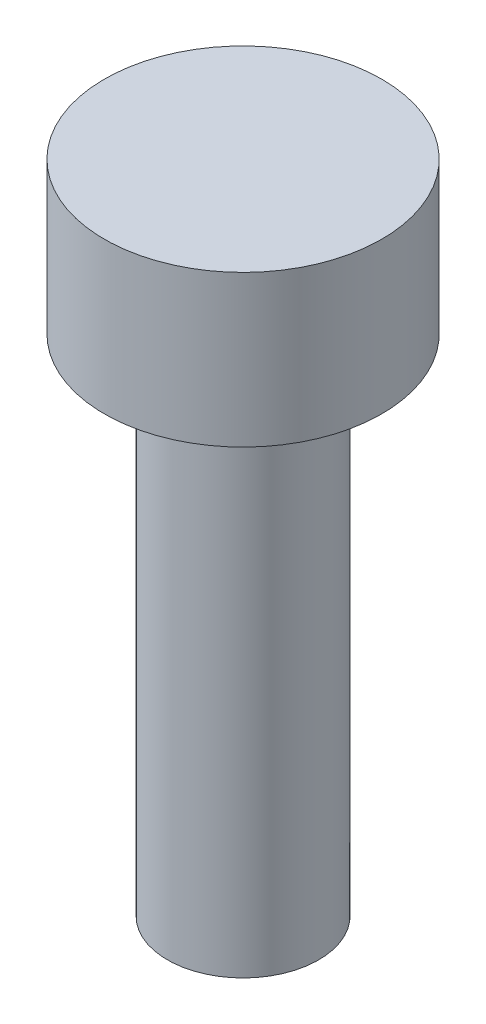
ISO-10303-21;
HEADER;
FILE_DESCRIPTION(('STEP AP214'),'2;1');
FILE_NAME('part.step','',(''),(''),'','','');
FILE_SCHEMA(('AUTOMOTIVE_DESIGN { 1 0 10303 214 1 1 1 1 }'));
ENDSEC;
DATA;
#1=APPLICATION_CONTEXT('core data for automotive mechanical design processes');
#2=APPLICATION_PROTOCOL_DEFINITION('international standard','automotive_design',2000,#1);
#3=PRODUCT_CONTEXT('',#1,'mechanical');
#4=PRODUCT('Part','Part','',(#3));
#5=PRODUCT_RELATED_PRODUCT_CATEGORY('part','',(#4));
#6=PRODUCT_DEFINITION_FORMATION('','',#4);
#7=PRODUCT_DEFINITION_CONTEXT('part definition',#1,'design');
#8=PRODUCT_DEFINITION('design','',#6,#7);
#9=PRODUCT_DEFINITION_SHAPE('','',#8);
#10=(LENGTH_UNIT() NAMED_UNIT(*) SI_UNIT(.MILLI.,.METRE.));
#11=(NAMED_UNIT(*) PLANE_ANGLE_UNIT() SI_UNIT($,.RADIAN.));
#12=(NAMED_UNIT(*) SI_UNIT($,.STERADIAN.) SOLID_ANGLE_UNIT());
#13=UNCERTAINTY_MEASURE_WITH_UNIT(LENGTH_MEASURE(1.E-05),#10,'distance_accuracy_value','');
#14=(GEOMETRIC_REPRESENTATION_CONTEXT(3) GLOBAL_UNCERTAINTY_ASSIGNED_CONTEXT((#13)) GLOBAL_UNIT_ASSIGNED_CONTEXT((#10,
#11,#12)) REPRESENTATION_CONTEXT('',''));
#15=CARTESIAN_POINT('',(0.,0.,0.));
#16=DIRECTION('',(0.,0.,1.));
#17=DIRECTION('',(1.,0.,0.));
#18=AXIS2_PLACEMENT_3D('',#15,#16,#17);
#19=CARTESIAN_POINT('',(0.,13.,0.));
#20=DIRECTION('',(0.,1.,0.));
#21=DIRECTION('',(0.,0.,1.));
#22=AXIS2_PLACEMENT_3D('',#19,#20,#21);
#23=PLANE('',#22);
#24=CARTESIAN_POINT('',(0.,13.,0.));
#25=DIRECTION('',(0.,-1.,0.));
#26=DIRECTION('',(0.,0.,-1.));
#27=AXIS2_PLACEMENT_3D('',#24,#25,#26);
#28=CIRCLE('',#27,2.75);
#29=CARTESIAN_POINT('',(0.,13.,-2.75));
#30=VERTEX_POINT('',#29);
#31=EDGE_CURVE('E10',#30,#30,#28,.T.);
#32=ORIENTED_EDGE('',*,*,#31,.F.);
#33=EDGE_LOOP('',(#32));
#34=FACE_BOUND('',#33,.T.);
#35=ADVANCED_FACE('F32',(#34),#23,.T.);
#36=CARTESIAN_POINT('',(0.,0.,0.));
#37=DIRECTION('',(0.,-1.,0.));
#38=DIRECTION('',(0.,0.,-1.));
#39=AXIS2_PLACEMENT_3D('',#36,#37,#38);
#40=CYLINDRICAL_SURFACE('',#39,2.75);
#41=ORIENTED_EDGE('',*,*,#31,.T.);
#42=EDGE_LOOP('',(#41));
#43=FACE_BOUND('',#42,.T.);
#44=CARTESIAN_POINT('',(0.,10.,0.));
#45=DIRECTION('',(0.,-1.,0.));
#46=DIRECTION('',(0.,0.,-1.));
#47=AXIS2_PLACEMENT_3D('',#44,#45,#46);
#48=CIRCLE('',#47,2.75);
#49=CARTESIAN_POINT('',(0.,10.,-2.75));
#50=VERTEX_POINT('',#49);
#51=EDGE_CURVE('E38',#50,#50,#48,.T.);
#52=ORIENTED_EDGE('',*,*,#51,.F.);
#53=EDGE_LOOP('',(#52));
#54=FACE_BOUND('',#53,.T.);
#55=ADVANCED_FACE('F64',(#43,#54),#40,.T.);
#56=CARTESIAN_POINT('',(2.75,10.,0.));
#57=DIRECTION('',(0.,-1.,0.));
#58=DIRECTION('',(0.,0.,-1.));
#59=AXIS2_PLACEMENT_3D('',#56,#57,#58);
#60=PLANE('',#59);
#61=ORIENTED_EDGE('',*,*,#51,.T.);
#62=EDGE_LOOP('',(#61));
#63=FACE_BOUND('',#62,.T.);
#64=CARTESIAN_POINT('',(0.,10.,0.));
#65=DIRECTION('',(0.,-1.,0.));
#66=DIRECTION('',(0.,0.,-1.));
#67=AXIS2_PLACEMENT_3D('',#64,#65,#66);
#68=CIRCLE('',#67,1.5);
#69=CARTESIAN_POINT('',(0.,10.,-1.5));
#70=VERTEX_POINT('',#69);
#71=EDGE_CURVE('E42',#70,#70,#68,.T.);
#72=ORIENTED_EDGE('',*,*,#71,.F.);
#73=EDGE_LOOP('',(#72));
#74=FACE_BOUND('',#73,.T.);
#75=ADVANCED_FACE('F56',(#63,#74),#60,.T.);
#76=CARTESIAN_POINT('',(0.,0.,0.));
#77=DIRECTION('',(0.,-1.,0.));
#78=DIRECTION('',(0.,0.,-1.));
#79=AXIS2_PLACEMENT_3D('',#76,#77,#78);
#80=CYLINDRICAL_SURFACE('',#79,1.5);
#81=ORIENTED_EDGE('',*,*,#71,.T.);
#82=EDGE_LOOP('',(#81));
#83=FACE_BOUND('',#82,.T.);
#84=CARTESIAN_POINT('',(0.,0.,0.));
#85=DIRECTION('',(0.,-1.,0.));
#86=DIRECTION('',(0.,0.,-1.));
#87=AXIS2_PLACEMENT_3D('',#84,#85,#86);
#88=CIRCLE('',#87,1.5);
#89=CARTESIAN_POINT('',(0.,0.,-1.5));
#90=VERTEX_POINT('',#89);
#91=EDGE_CURVE('E46',#90,#90,#88,.T.);
#92=ORIENTED_EDGE('',*,*,#91,.F.);
#93=EDGE_LOOP('',(#92));
#94=FACE_BOUND('',#93,.T.);
#95=ADVANCED_FACE('F54',(#83,#94),#80,.T.);
#96=CARTESIAN_POINT('',(1.5,0.,0.));
#97=DIRECTION('',(0.,-1.,0.));
#98=DIRECTION('',(0.,0.,-1.));
#99=AXIS2_PLACEMENT_3D('',#96,#97,#98);
#100=PLANE('',#99);
#101=ORIENTED_EDGE('',*,*,#91,.T.);
#102=EDGE_LOOP('',(#101));
#103=FACE_BOUND('',#102,.T.);
#104=ADVANCED_FACE('F52',(#103),#100,.T.);
#105=CLOSED_SHELL('',(#35,#55,#75,#95,#104));
#106=MANIFOLD_SOLID_BREP('B2',#105);
#107=ADVANCED_BREP_SHAPE_REPRESENTATION('',(#18,#106),#14);
#108=SHAPE_DEFINITION_REPRESENTATION(#9,#107);
ENDSEC;
END-ISO-10303-21;
